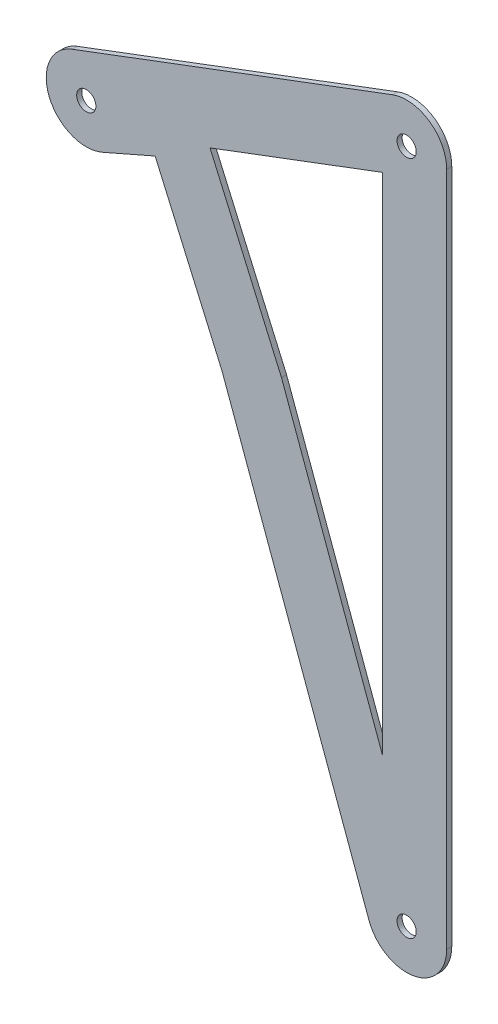
ISO-10303-21;
HEADER;
FILE_DESCRIPTION(('STEP AP214'),'2;1');
FILE_NAME('part.step','',(''),(''),'','','');
FILE_SCHEMA(('AUTOMOTIVE_DESIGN { 1 0 10303 214 1 1 1 1 }'));
ENDSEC;
DATA;
#1=APPLICATION_CONTEXT('core data for automotive mechanical design processes');
#2=APPLICATION_PROTOCOL_DEFINITION('international standard','automotive_design',2000,#1);
#3=PRODUCT_CONTEXT('',#1,'mechanical');
#4=PRODUCT('Part','Part','',(#3));
#5=PRODUCT_RELATED_PRODUCT_CATEGORY('part','',(#4));
#6=PRODUCT_DEFINITION_FORMATION('','',#4);
#7=PRODUCT_DEFINITION_CONTEXT('part definition',#1,'design');
#8=PRODUCT_DEFINITION('design','',#6,#7);
#9=PRODUCT_DEFINITION_SHAPE('','',#8);
#10=(LENGTH_UNIT() NAMED_UNIT(*) SI_UNIT(.MILLI.,.METRE.));
#11=(NAMED_UNIT(*) PLANE_ANGLE_UNIT() SI_UNIT($,.RADIAN.));
#12=(NAMED_UNIT(*) SI_UNIT($,.STERADIAN.) SOLID_ANGLE_UNIT());
#13=UNCERTAINTY_MEASURE_WITH_UNIT(LENGTH_MEASURE(1.E-05),#10,'distance_accuracy_value','');
#14=(GEOMETRIC_REPRESENTATION_CONTEXT(3) GLOBAL_UNCERTAINTY_ASSIGNED_CONTEXT((#13)) GLOBAL_UNIT_ASSIGNED_CONTEXT((#10,
#11,#12)) REPRESENTATION_CONTEXT('',''));
#15=CARTESIAN_POINT('',(0.,0.,0.));
#16=DIRECTION('',(0.,0.,1.));
#17=DIRECTION('',(1.,0.,0.));
#18=AXIS2_PLACEMENT_3D('',#15,#16,#17);
#19=CARTESIAN_POINT('',(0.,0.,1.5875));
#20=DIRECTION('',(0.,0.,1.));
#21=DIRECTION('',(1.,0.,0.));
#22=AXIS2_PLACEMENT_3D('',#19,#20,#21);
#23=PLANE('',#22);
#24=DIRECTION('',(0.343153938313491,-0.939279178210579,0.));
#25=VECTOR('',#24,1.);
#26=CARTESIAN_POINT('',(-39.0677229953301,128.792048742967,1.5875));
#27=LINE('',#26,#25);
#28=CARTESIAN_POINT('',(-39.0677229953301,128.792048742967,1.5875));
#29=VERTEX_POINT('',#28);
#30=CARTESIAN_POINT('',(-7.5,42.3850412676658,1.5875));
#31=VERTEX_POINT('',#30);
#32=EDGE_CURVE('E134',#29,#31,#27,.T.);
#33=ORIENTED_EDGE('',*,*,#32,.F.);
#34=DIRECTION('',(0.401127948098516,-0.916022035354104,0.));
#35=VECTOR('',#34,1.);
#36=CARTESIAN_POINT('',(-39.0677229953301,128.792048742967,1.5875));
#37=LINE('',#36,#35);
#38=CARTESIAN_POINT('',(-61.3797298495067,179.744095411074,1.5875));
#39=VERTEX_POINT('',#38);
#40=EDGE_CURVE('E126',#39,#29,#37,.T.);
#41=ORIENTED_EDGE('',*,*,#40,.F.);
#42=DIRECTION('',(-0.935760073730109,-0.35263732702682,0.));
#43=VECTOR('',#42,1.);
#44=CARTESIAN_POINT('',(-7.5,200.048449538216,1.5875));
#45=LINE('',#44,#43);
#46=CARTESIAN_POINT('',(-7.50000000000001,200.048449538216,1.5875));
#47=VERTEX_POINT('',#46);
#48=EDGE_CURVE('E149',#47,#39,#45,.T.);
#49=ORIENTED_EDGE('',*,*,#48,.F.);
#50=DIRECTION('',(0.,1.,0.));
#51=VECTOR('',#50,1.);
#52=CARTESIAN_POINT('',(-7.5,42.3850412676658,1.5875));
#53=LINE('',#52,#51);
#54=EDGE_CURVE('E147',#31,#47,#53,.T.);
#55=ORIENTED_EDGE('',*,*,#54,.F.);
#56=EDGE_LOOP('',(#33,#41,#49,#55));
#57=FACE_BOUND('',#56,.T.);
#58=CARTESIAN_POINT('',(0.,210.889668604405,1.5875));
#59=DIRECTION('',(0.,0.,1.));
#60=DIRECTION('',(1.,0.,0.));
#61=AXIS2_PLACEMENT_3D('',#58,#59,#60);
#62=CIRCLE('',#61,3.);
#63=CARTESIAN_POINT('',(3.,210.889668604405,1.5875));
#64=VERTEX_POINT('',#63);
#65=EDGE_CURVE('E165',#64,#64,#62,.T.);
#66=ORIENTED_EDGE('',*,*,#65,.F.);
#67=EDGE_LOOP('',(#66));
#68=FACE_BOUND('',#67,.T.);
#69=CARTESIAN_POINT('',(0.,0.,1.5875));
#70=DIRECTION('',(0.,0.,1.));
#71=DIRECTION('',(1.,0.,0.));
#72=AXIS2_PLACEMENT_3D('',#69,#70,#71);
#73=CIRCLE('',#72,12.5);
#74=CARTESIAN_POINT('',(-11.7409897276322,-4.28942422891863,1.5875));
#75=VERTEX_POINT('',#74);
#76=CARTESIAN_POINT('',(12.5,0.,1.5875));
#77=VERTEX_POINT('',#76);
#78=EDGE_CURVE('E177',#75,#77,#73,.T.);
#79=ORIENTED_EDGE('',*,*,#78,.T.);
#80=DIRECTION('',(0.,1.,0.));
#81=VECTOR('',#80,1.);
#82=CARTESIAN_POINT('',(12.5,0.,1.5875));
#83=LINE('',#82,#81);
#84=CARTESIAN_POINT('',(12.5,210.889668604405,1.5875));
#85=VERTEX_POINT('',#84);
#86=EDGE_CURVE('E180',#77,#85,#83,.T.);
#87=ORIENTED_EDGE('',*,*,#86,.T.);
#88=CARTESIAN_POINT('',(0.,210.889668604405,1.5875));
#89=DIRECTION('',(0.,0.,1.));
#90=DIRECTION('',(1.,0.,0.));
#91=AXIS2_PLACEMENT_3D('',#88,#89,#90);
#92=CIRCLE('',#91,12.5);
#93=CARTESIAN_POINT('',(-4.40796658783525,222.586669526032,1.5875));
#94=VERTEX_POINT('',#93);
#95=EDGE_CURVE('E183',#85,#94,#92,.T.);
#96=ORIENTED_EDGE('',*,*,#95,.T.);
#97=DIRECTION('',(-0.935760073730109,-0.352637327026819,0.));
#98=VECTOR('',#97,1.);
#99=CARTESIAN_POINT('',(-4.40796658783525,222.586669526032,1.5875));
#100=LINE('',#99,#98);
#101=CARTESIAN_POINT('',(-104.407966587835,184.902081678514,1.5875));
#102=VERTEX_POINT('',#101);
#103=EDGE_CURVE('E185',#94,#102,#100,.T.);
#104=ORIENTED_EDGE('',*,*,#103,.T.);
#105=CARTESIAN_POINT('',(-100.,173.205080756888,1.5875));
#106=DIRECTION('',(0.,0.,1.));
#107=DIRECTION('',(1.,0.,0.));
#108=AXIS2_PLACEMENT_3D('',#105,#106,#107);
#109=CIRCLE('',#108,12.4999999999999);
#110=CARTESIAN_POINT('',(-94.9859006487685,161.754805314961,1.5875));
#111=VERTEX_POINT('',#110);
#112=EDGE_CURVE('E187',#102,#111,#109,.T.);
#113=ORIENTED_EDGE('',*,*,#112,.T.);
#114=DIRECTION('',(0.916022035354103,0.401127948098516,0.));
#115=VECTOR('',#114,1.);
#116=CARTESIAN_POINT('',(-94.9859006487685,161.754805314961,1.5875));
#117=LINE('',#116,#115);
#118=CARTESIAN_POINT('',(-78.4975040123947,168.975108380735,1.5875));
#119=VERTEX_POINT('',#118);
#120=EDGE_CURVE('E189',#111,#119,#117,.T.);
#121=ORIENTED_EDGE('',*,*,#120,.T.);
#122=DIRECTION('',(0.401127948098516,-0.916022035354103,0.));
#123=VECTOR('',#122,1.);
#124=CARTESIAN_POINT('',(-57.6388507112718,121.341962542321,1.5875));
#125=LINE('',#124,#123);
#126=CARTESIAN_POINT('',(-57.6388507112718,121.341962542321,1.5875));
#127=VERTEX_POINT('',#126);
#128=EDGE_CURVE('E191',#119,#127,#125,.T.);
#129=ORIENTED_EDGE('',*,*,#128,.T.);
#130=DIRECTION('',(0.343153938313491,-0.939279178210579,0.));
#131=VECTOR('',#130,1.);
#132=CARTESIAN_POINT('',(-57.6388507112718,121.341962542321,1.5875));
#133=LINE('',#132,#131);
#134=EDGE_CURVE('E193',#127,#75,#133,.T.);
#135=ORIENTED_EDGE('',*,*,#134,.T.);
#136=EDGE_LOOP('',(#79,#87,#96,#104,#113,#121,#129,#135));
#137=FACE_BOUND('',#136,.T.);
#138=CARTESIAN_POINT('',(-100.,173.205080756888,1.5875));
#139=DIRECTION('',(0.,0.,1.));
#140=DIRECTION('',(1.,0.,0.));
#141=AXIS2_PLACEMENT_3D('',#138,#139,#140);
#142=CIRCLE('',#141,2.99999999999999);
#143=CARTESIAN_POINT('',(-97.,173.205080756888,1.5875));
#144=VERTEX_POINT('',#143);
#145=EDGE_CURVE('E171',#144,#144,#142,.T.);
#146=ORIENTED_EDGE('',*,*,#145,.F.);
#147=EDGE_LOOP('',(#146));
#148=FACE_BOUND('',#147,.T.);
#149=CARTESIAN_POINT('',(0.,0.,1.5875));
#150=DIRECTION('',(0.,0.,1.));
#151=DIRECTION('',(1.,0.,0.));
#152=AXIS2_PLACEMENT_3D('',#149,#150,#151);
#153=CIRCLE('',#152,3.);
#154=CARTESIAN_POINT('',(3.,0.,1.5875));
#155=VERTEX_POINT('',#154);
#156=EDGE_CURVE('E155',#155,#155,#153,.T.);
#157=ORIENTED_EDGE('',*,*,#156,.F.);
#158=EDGE_LOOP('',(#157));
#159=FACE_BOUND('',#158,.T.);
#160=ADVANCED_FACE('F37',(#57,#68,#137,#148,#159),#23,.T.);
#161=CARTESIAN_POINT('',(0.,0.,0.));
#162=DIRECTION('',(0.,0.,1.));
#163=DIRECTION('',(1.,0.,0.));
#164=AXIS2_PLACEMENT_3D('',#161,#162,#163);
#165=PLANE('',#164);
#166=CARTESIAN_POINT('',(0.,210.889668604405,0.));
#167=DIRECTION('',(0.,0.,1.));
#168=DIRECTION('',(1.,0.,0.));
#169=AXIS2_PLACEMENT_3D('',#166,#167,#168);
#170=CIRCLE('',#169,3.);
#171=CARTESIAN_POINT('',(3.,210.889668604405,0.));
#172=VERTEX_POINT('',#171);
#173=EDGE_CURVE('E142',#172,#172,#170,.T.);
#174=ORIENTED_EDGE('',*,*,#173,.T.);
#175=EDGE_LOOP('',(#174));
#176=FACE_BOUND('',#175,.T.);
#177=CARTESIAN_POINT('',(-100.,173.205080756888,0.));
#178=DIRECTION('',(0.,0.,1.));
#179=DIRECTION('',(1.,0.,0.));
#180=AXIS2_PLACEMENT_3D('',#177,#178,#179);
#181=CIRCLE('',#180,2.99999999999999);
#182=CARTESIAN_POINT('',(-97.,173.205080756888,0.));
#183=VERTEX_POINT('',#182);
#184=EDGE_CURVE('E168',#183,#183,#181,.T.);
#185=ORIENTED_EDGE('',*,*,#184,.T.);
#186=EDGE_LOOP('',(#185));
#187=FACE_BOUND('',#186,.T.);
#188=CARTESIAN_POINT('',(0.,0.,0.));
#189=DIRECTION('',(0.,0.,1.));
#190=DIRECTION('',(1.,0.,0.));
#191=AXIS2_PLACEMENT_3D('',#188,#189,#190);
#192=CIRCLE('',#191,12.5);
#193=CARTESIAN_POINT('',(-11.7409897276322,-4.28942422891863,0.));
#194=VERTEX_POINT('',#193);
#195=CARTESIAN_POINT('',(12.5,0.,0.));
#196=VERTEX_POINT('',#195);
#197=EDGE_CURVE('E174',#194,#196,#192,.T.);
#198=ORIENTED_EDGE('',*,*,#197,.F.);
#199=DIRECTION('',(0.343153938313491,-0.939279178210579,0.));
#200=VECTOR('',#199,1.);
#201=CARTESIAN_POINT('',(-57.6388507112718,121.341962542321,0.));
#202=LINE('',#201,#200);
#203=CARTESIAN_POINT('',(-57.6388507112718,121.341962542321,0.));
#204=VERTEX_POINT('',#203);
#205=EDGE_CURVE('E181',#204,#194,#202,.T.);
#206=ORIENTED_EDGE('',*,*,#205,.F.);
#207=DIRECTION('',(0.401127948098516,-0.916022035354103,0.));
#208=VECTOR('',#207,1.);
#209=CARTESIAN_POINT('',(-57.6388507112718,121.341962542321,0.));
#210=LINE('',#209,#208);
#211=CARTESIAN_POINT('',(-78.4975040123947,168.975108380735,0.));
#212=VERTEX_POINT('',#211);
#213=EDGE_CURVE('E208',#212,#204,#210,.T.);
#214=ORIENTED_EDGE('',*,*,#213,.F.);
#215=DIRECTION('',(0.916022035354103,0.401127948098516,0.));
#216=VECTOR('',#215,1.);
#217=CARTESIAN_POINT('',(-94.9859006487685,161.754805314961,0.));
#218=LINE('',#217,#216);
#219=CARTESIAN_POINT('',(-94.9859006487685,161.754805314961,0.));
#220=VERTEX_POINT('',#219);
#221=EDGE_CURVE('E206',#220,#212,#218,.T.);
#222=ORIENTED_EDGE('',*,*,#221,.F.);
#223=CARTESIAN_POINT('',(-100.,173.205080756888,0.));
#224=DIRECTION('',(0.,0.,1.));
#225=DIRECTION('',(1.,0.,0.));
#226=AXIS2_PLACEMENT_3D('',#223,#224,#225);
#227=CIRCLE('',#226,12.4999999999999);
#228=CARTESIAN_POINT('',(-104.407966587835,184.902081678514,0.));
#229=VERTEX_POINT('',#228);
#230=EDGE_CURVE('E204',#229,#220,#227,.T.);
#231=ORIENTED_EDGE('',*,*,#230,.F.);
#232=DIRECTION('',(-0.935760073730109,-0.352637327026819,0.));
#233=VECTOR('',#232,1.);
#234=CARTESIAN_POINT('',(-4.40796658783525,222.586669526032,0.));
#235=LINE('',#234,#233);
#236=CARTESIAN_POINT('',(-4.40796658783525,222.586669526032,0.));
#237=VERTEX_POINT('',#236);
#238=EDGE_CURVE('E202',#237,#229,#235,.T.);
#239=ORIENTED_EDGE('',*,*,#238,.F.);
#240=CARTESIAN_POINT('',(0.,210.889668604405,0.));
#241=DIRECTION('',(0.,0.,1.));
#242=DIRECTION('',(1.,0.,0.));
#243=AXIS2_PLACEMENT_3D('',#240,#241,#242);
#244=CIRCLE('',#243,12.5);
#245=CARTESIAN_POINT('',(12.5,210.889668604405,0.));
#246=VERTEX_POINT('',#245);
#247=EDGE_CURVE('E200',#246,#237,#244,.T.);
#248=ORIENTED_EDGE('',*,*,#247,.F.);
#249=DIRECTION('',(0.,1.,0.));
#250=VECTOR('',#249,1.);
#251=CARTESIAN_POINT('',(12.5,0.,0.));
#252=LINE('',#251,#250);
#253=EDGE_CURVE('E198',#196,#246,#252,.T.);
#254=ORIENTED_EDGE('',*,*,#253,.F.);
#255=EDGE_LOOP('',(#198,#206,#214,#222,#231,#239,#248,#254));
#256=FACE_BOUND('',#255,.T.);
#257=DIRECTION('',(0.401127948098516,-0.916022035354104,0.));
#258=VECTOR('',#257,1.);
#259=CARTESIAN_POINT('',(-39.0677229953301,128.792048742967,0.));
#260=LINE('',#259,#258);
#261=CARTESIAN_POINT('',(-61.3797298495067,179.744095411074,0.));
#262=VERTEX_POINT('',#261);
#263=CARTESIAN_POINT('',(-39.0677229953301,128.792048742967,0.));
#264=VERTEX_POINT('',#263);
#265=EDGE_CURVE('E60',#262,#264,#260,.T.);
#266=ORIENTED_EDGE('',*,*,#265,.T.);
#267=DIRECTION('',(0.343153938313491,-0.939279178210579,0.));
#268=VECTOR('',#267,1.);
#269=CARTESIAN_POINT('',(-39.0677229953301,128.792048742967,0.));
#270=LINE('',#269,#268);
#271=CARTESIAN_POINT('',(-7.5,42.3850412676658,0.));
#272=VERTEX_POINT('',#271);
#273=EDGE_CURVE('E141',#264,#272,#270,.T.);
#274=ORIENTED_EDGE('',*,*,#273,.T.);
#275=DIRECTION('',(0.,1.,0.));
#276=VECTOR('',#275,1.);
#277=CARTESIAN_POINT('',(-7.5,42.3850412676658,0.));
#278=LINE('',#277,#276);
#279=CARTESIAN_POINT('',(-7.5,200.048449538216,0.));
#280=VERTEX_POINT('',#279);
#281=EDGE_CURVE('E157',#272,#280,#278,.T.);
#282=ORIENTED_EDGE('',*,*,#281,.T.);
#283=DIRECTION('',(-0.935760073730109,-0.35263732702682,0.));
#284=VECTOR('',#283,1.);
#285=CARTESIAN_POINT('',(-7.5,200.048449538216,0.));
#286=LINE('',#285,#284);
#287=EDGE_CURVE('E135',#280,#262,#286,.T.);
#288=ORIENTED_EDGE('',*,*,#287,.T.);
#289=EDGE_LOOP('',(#266,#274,#282,#288));
#290=FACE_BOUND('',#289,.T.);
#291=CARTESIAN_POINT('',(0.,0.,0.));
#292=DIRECTION('',(0.,0.,1.));
#293=DIRECTION('',(1.,0.,0.));
#294=AXIS2_PLACEMENT_3D('',#291,#292,#293);
#295=CIRCLE('',#294,3.);
#296=CARTESIAN_POINT('',(3.,0.,0.));
#297=VERTEX_POINT('',#296);
#298=EDGE_CURVE('E307',#297,#297,#295,.T.);
#299=ORIENTED_EDGE('',*,*,#298,.T.);
#300=EDGE_LOOP('',(#299));
#301=FACE_BOUND('',#300,.T.);
#302=ADVANCED_FACE('F238',(#176,#187,#256,#290,#301),#165,.F.);
#303=CARTESIAN_POINT('',(0.,0.,1.5875));
#304=DIRECTION('',(0.,0.,-1.));
#305=DIRECTION('',(-1.,0.,0.));
#306=AXIS2_PLACEMENT_3D('',#303,#304,#305);
#307=CYLINDRICAL_SURFACE('',#306,12.5);
#308=ORIENTED_EDGE('',*,*,#197,.T.);
#309=DIRECTION('',(0.,0.,-1.));
#310=VECTOR('',#309,1.);
#311=CARTESIAN_POINT('',(12.5,0.,1.5875));
#312=LINE('',#311,#310);
#313=EDGE_CURVE('E11',#77,#196,#312,.T.);
#314=ORIENTED_EDGE('',*,*,#313,.F.);
#315=ORIENTED_EDGE('',*,*,#78,.F.);
#316=DIRECTION('',(0.,0.,-1.));
#317=VECTOR('',#316,1.);
#318=CARTESIAN_POINT('',(-11.7409897276322,-4.28942422891863,1.5875));
#319=LINE('',#318,#317);
#320=EDGE_CURVE('E195',#75,#194,#319,.T.);
#321=ORIENTED_EDGE('',*,*,#320,.T.);
#322=EDGE_LOOP('',(#308,#314,#315,#321));
#323=FACE_BOUND('',#322,.T.);
#324=ADVANCED_FACE('F39',(#323),#307,.T.);
#325=CARTESIAN_POINT('',(12.5,0.,1.5875));
#326=DIRECTION('',(-1.,0.,0.));
#327=DIRECTION('',(0.,-1.,0.));
#328=AXIS2_PLACEMENT_3D('',#325,#326,#327);
#329=PLANE('',#328);
#330=ORIENTED_EDGE('',*,*,#253,.T.);
#331=DIRECTION('',(0.,0.,-1.));
#332=VECTOR('',#331,1.);
#333=CARTESIAN_POINT('',(12.5,210.889668604405,1.5875));
#334=LINE('',#333,#332);
#335=EDGE_CURVE('E45',#85,#246,#334,.T.);
#336=ORIENTED_EDGE('',*,*,#335,.F.);
#337=ORIENTED_EDGE('',*,*,#86,.F.);
#338=ORIENTED_EDGE('',*,*,#313,.T.);
#339=EDGE_LOOP('',(#330,#336,#337,#338));
#340=FACE_BOUND('',#339,.T.);
#341=ADVANCED_FACE('F256',(#340),#329,.F.);
#342=CARTESIAN_POINT('',(0.,210.889668604405,1.5875));
#343=DIRECTION('',(0.,0.,-1.));
#344=DIRECTION('',(-1.,0.,0.));
#345=AXIS2_PLACEMENT_3D('',#342,#343,#344);
#346=CYLINDRICAL_SURFACE('',#345,12.5);
#347=ORIENTED_EDGE('',*,*,#247,.T.);
#348=DIRECTION('',(0.,0.,-1.));
#349=VECTOR('',#348,1.);
#350=CARTESIAN_POINT('',(-4.40796658783525,222.586669526032,1.5875));
#351=LINE('',#350,#349);
#352=EDGE_CURVE('E225',#94,#237,#351,.T.);
#353=ORIENTED_EDGE('',*,*,#352,.F.);
#354=ORIENTED_EDGE('',*,*,#95,.F.);
#355=ORIENTED_EDGE('',*,*,#335,.T.);
#356=EDGE_LOOP('',(#347,#353,#354,#355));
#357=FACE_BOUND('',#356,.T.);
#358=ADVANCED_FACE('F232',(#357),#346,.T.);
#359=CARTESIAN_POINT('',(-4.40796658783525,222.586669526032,1.5875));
#360=DIRECTION('',(0.352637327026819,-0.935760073730109,0.));
#361=DIRECTION('',(0.935760073730109,0.352637327026819,0.));
#362=AXIS2_PLACEMENT_3D('',#359,#360,#361);
#363=PLANE('',#362);
#364=ORIENTED_EDGE('',*,*,#238,.T.);
#365=DIRECTION('',(0.,0.,-1.));
#366=VECTOR('',#365,1.);
#367=CARTESIAN_POINT('',(-104.407966587835,184.902081678514,1.5875));
#368=LINE('',#367,#366);
#369=EDGE_CURVE('E222',#102,#229,#368,.T.);
#370=ORIENTED_EDGE('',*,*,#369,.F.);
#371=ORIENTED_EDGE('',*,*,#103,.F.);
#372=ORIENTED_EDGE('',*,*,#352,.T.);
#373=EDGE_LOOP('',(#364,#370,#371,#372));
#374=FACE_BOUND('',#373,.T.);
#375=ADVANCED_FACE('F244',(#374),#363,.F.);
#376=CARTESIAN_POINT('',(-100.,173.205080756888,1.5875));
#377=DIRECTION('',(0.,0.,-1.));
#378=DIRECTION('',(-1.,0.,0.));
#379=AXIS2_PLACEMENT_3D('',#376,#377,#378);
#380=CYLINDRICAL_SURFACE('',#379,12.4999999999999);
#381=ORIENTED_EDGE('',*,*,#230,.T.);
#382=DIRECTION('',(0.,0.,-1.));
#383=VECTOR('',#382,1.);
#384=CARTESIAN_POINT('',(-94.9859006487685,161.754805314961,1.5875));
#385=LINE('',#384,#383);
#386=EDGE_CURVE('E219',#111,#220,#385,.T.);
#387=ORIENTED_EDGE('',*,*,#386,.F.);
#388=ORIENTED_EDGE('',*,*,#112,.F.);
#389=ORIENTED_EDGE('',*,*,#369,.T.);
#390=EDGE_LOOP('',(#381,#387,#388,#389));
#391=FACE_BOUND('',#390,.T.);
#392=ADVANCED_FACE('F248',(#391),#380,.T.);
#393=CARTESIAN_POINT('',(-94.9859006487685,161.754805314961,1.5875));
#394=DIRECTION('',(-0.401127948098516,0.916022035354103,0.));
#395=DIRECTION('',(-0.916022035354103,-0.401127948098516,0.));
#396=AXIS2_PLACEMENT_3D('',#393,#394,#395);
#397=PLANE('',#396);
#398=ORIENTED_EDGE('',*,*,#221,.T.);
#399=DIRECTION('',(0.,0.,-1.));
#400=VECTOR('',#399,1.);
#401=CARTESIAN_POINT('',(-78.4975040123947,168.975108380735,1.5875));
#402=LINE('',#401,#400);
#403=EDGE_CURVE('E216',#119,#212,#402,.T.);
#404=ORIENTED_EDGE('',*,*,#403,.F.);
#405=ORIENTED_EDGE('',*,*,#120,.F.);
#406=ORIENTED_EDGE('',*,*,#386,.T.);
#407=EDGE_LOOP('',(#398,#404,#405,#406));
#408=FACE_BOUND('',#407,.T.);
#409=ADVANCED_FACE('F269',(#408),#397,.F.);
#410=CARTESIAN_POINT('',(-57.6388507112718,121.341962542321,1.5875));
#411=DIRECTION('',(0.916022035354103,0.401127948098516,0.));
#412=DIRECTION('',(-0.401127948098516,0.916022035354103,0.));
#413=AXIS2_PLACEMENT_3D('',#410,#411,#412);
#414=PLANE('',#413);
#415=ORIENTED_EDGE('',*,*,#213,.T.);
#416=DIRECTION('',(0.,0.,-1.));
#417=VECTOR('',#416,1.);
#418=CARTESIAN_POINT('',(-57.6388507112718,121.341962542321,1.5875));
#419=LINE('',#418,#417);
#420=EDGE_CURVE('E213',#127,#204,#419,.T.);
#421=ORIENTED_EDGE('',*,*,#420,.F.);
#422=ORIENTED_EDGE('',*,*,#128,.F.);
#423=ORIENTED_EDGE('',*,*,#403,.T.);
#424=EDGE_LOOP('',(#415,#421,#422,#423));
#425=FACE_BOUND('',#424,.T.);
#426=ADVANCED_FACE('F267',(#425),#414,.F.);
#427=CARTESIAN_POINT('',(-57.6388507112718,121.341962542321,1.5875));
#428=DIRECTION('',(0.939279178210579,0.343153938313491,0.));
#429=DIRECTION('',(-0.343153938313491,0.939279178210579,0.));
#430=AXIS2_PLACEMENT_3D('',#427,#428,#429);
#431=PLANE('',#430);
#432=ORIENTED_EDGE('',*,*,#205,.T.);
#433=ORIENTED_EDGE('',*,*,#320,.F.);
#434=ORIENTED_EDGE('',*,*,#134,.F.);
#435=ORIENTED_EDGE('',*,*,#420,.T.);
#436=EDGE_LOOP('',(#432,#433,#434,#435));
#437=FACE_BOUND('',#436,.T.);
#438=ADVANCED_FACE('F262',(#437),#431,.F.);
#439=CARTESIAN_POINT('',(-100.,173.205080756888,1.5875));
#440=DIRECTION('',(0.,0.,-1.));
#441=DIRECTION('',(-1.,0.,0.));
#442=AXIS2_PLACEMENT_3D('',#439,#440,#441);
#443=CYLINDRICAL_SURFACE('',#442,2.99999999999999);
#444=ORIENTED_EDGE('',*,*,#145,.T.);
#445=EDGE_LOOP('',(#444));
#446=FACE_BOUND('',#445,.T.);
#447=ORIENTED_EDGE('',*,*,#184,.F.);
#448=EDGE_LOOP('',(#447));
#449=FACE_BOUND('',#448,.T.);
#450=ADVANCED_FACE('F286',(#446,#449),#443,.F.);
#451=CARTESIAN_POINT('',(0.,210.889668604405,1.5875));
#452=DIRECTION('',(0.,0.,-1.));
#453=DIRECTION('',(-1.,0.,0.));
#454=AXIS2_PLACEMENT_3D('',#451,#452,#453);
#455=CYLINDRICAL_SURFACE('',#454,3.);
#456=ORIENTED_EDGE('',*,*,#65,.T.);
#457=EDGE_LOOP('',(#456));
#458=FACE_BOUND('',#457,.T.);
#459=ORIENTED_EDGE('',*,*,#173,.F.);
#460=EDGE_LOOP('',(#459));
#461=FACE_BOUND('',#460,.T.);
#462=ADVANCED_FACE('F293',(#458,#461),#455,.F.);
#463=CARTESIAN_POINT('',(-39.0677229953301,128.792048742967,1.5875));
#464=DIRECTION('',(0.916022035354104,0.401127948098516,0.));
#465=DIRECTION('',(-0.401127948098516,0.916022035354104,0.));
#466=AXIS2_PLACEMENT_3D('',#463,#464,#465);
#467=PLANE('',#466);
#468=ORIENTED_EDGE('',*,*,#265,.F.);
#469=DIRECTION('',(0.,0.,-1.));
#470=VECTOR('',#469,1.);
#471=CARTESIAN_POINT('',(-61.3797298495067,179.744095411074,1.5875));
#472=LINE('',#471,#470);
#473=EDGE_CURVE('E130',#39,#262,#472,.T.);
#474=ORIENTED_EDGE('',*,*,#473,.F.);
#475=ORIENTED_EDGE('',*,*,#40,.T.);
#476=DIRECTION('',(0.,0.,-1.));
#477=VECTOR('',#476,1.);
#478=CARTESIAN_POINT('',(-39.0677229953301,128.792048742967,1.5875));
#479=LINE('',#478,#477);
#480=EDGE_CURVE('E129',#29,#264,#479,.T.);
#481=ORIENTED_EDGE('',*,*,#480,.T.);
#482=EDGE_LOOP('',(#468,#474,#475,#481));
#483=FACE_BOUND('',#482,.T.);
#484=ADVANCED_FACE('F128',(#483),#467,.T.);
#485=CARTESIAN_POINT('',(-39.0677229953301,128.792048742967,1.5875));
#486=DIRECTION('',(0.939279178210579,0.343153938313491,0.));
#487=DIRECTION('',(-0.343153938313491,0.939279178210579,0.));
#488=AXIS2_PLACEMENT_3D('',#485,#486,#487);
#489=PLANE('',#488);
#490=ORIENTED_EDGE('',*,*,#273,.F.);
#491=ORIENTED_EDGE('',*,*,#480,.F.);
#492=ORIENTED_EDGE('',*,*,#32,.T.);
#493=DIRECTION('',(0.,0.,-1.));
#494=VECTOR('',#493,1.);
#495=CARTESIAN_POINT('',(-7.5,42.3850412676658,1.5875));
#496=LINE('',#495,#494);
#497=EDGE_CURVE('E143',#31,#272,#496,.T.);
#498=ORIENTED_EDGE('',*,*,#497,.T.);
#499=EDGE_LOOP('',(#490,#491,#492,#498));
#500=FACE_BOUND('',#499,.T.);
#501=ADVANCED_FACE('F138',(#500),#489,.T.);
#502=CARTESIAN_POINT('',(-7.5,42.3850412676658,1.5875));
#503=DIRECTION('',(-1.,0.,0.));
#504=DIRECTION('',(0.,-1.,0.));
#505=AXIS2_PLACEMENT_3D('',#502,#503,#504);
#506=PLANE('',#505);
#507=ORIENTED_EDGE('',*,*,#281,.F.);
#508=ORIENTED_EDGE('',*,*,#497,.F.);
#509=ORIENTED_EDGE('',*,*,#54,.T.);
#510=DIRECTION('',(0.,0.,-1.));
#511=VECTOR('',#510,1.);
#512=CARTESIAN_POINT('',(-7.5,200.048449538216,1.5875));
#513=LINE('',#512,#511);
#514=EDGE_CURVE('E52',#47,#280,#513,.T.);
#515=ORIENTED_EDGE('',*,*,#514,.T.);
#516=EDGE_LOOP('',(#507,#508,#509,#515));
#517=FACE_BOUND('',#516,.T.);
#518=ADVANCED_FACE('F320',(#517),#506,.T.);
#519=CARTESIAN_POINT('',(-7.5,200.048449538216,1.5875));
#520=DIRECTION('',(0.35263732702682,-0.935760073730109,0.));
#521=DIRECTION('',(0.935760073730109,0.35263732702682,0.));
#522=AXIS2_PLACEMENT_3D('',#519,#520,#521);
#523=PLANE('',#522);
#524=ORIENTED_EDGE('',*,*,#287,.F.);
#525=ORIENTED_EDGE('',*,*,#514,.F.);
#526=ORIENTED_EDGE('',*,*,#48,.T.);
#527=ORIENTED_EDGE('',*,*,#473,.T.);
#528=EDGE_LOOP('',(#524,#525,#526,#527));
#529=FACE_BOUND('',#528,.T.);
#530=ADVANCED_FACE('F315',(#529),#523,.T.);
#531=CARTESIAN_POINT('',(0.,0.,1.5875));
#532=DIRECTION('',(0.,0.,-1.));
#533=DIRECTION('',(-1.,0.,0.));
#534=AXIS2_PLACEMENT_3D('',#531,#532,#533);
#535=CYLINDRICAL_SURFACE('',#534,3.);
#536=ORIENTED_EDGE('',*,*,#156,.T.);
#537=EDGE_LOOP('',(#536));
#538=FACE_BOUND('',#537,.T.);
#539=ORIENTED_EDGE('',*,*,#298,.F.);
#540=EDGE_LOOP('',(#539));
#541=FACE_BOUND('',#540,.T.);
#542=ADVANCED_FACE('F313',(#538,#541),#535,.F.);
#543=CLOSED_SHELL('',(#160,#302,#324,#341,#358,#375,#392,#409,#426,#438,#450,#462,#484,#501,
#518,#530,#542));
#544=MANIFOLD_SOLID_BREP('B2',#543);
#545=ADVANCED_BREP_SHAPE_REPRESENTATION('',(#18,#544),#14);
#546=SHAPE_DEFINITION_REPRESENTATION(#9,#545);
ENDSEC;
END-ISO-10303-21;
